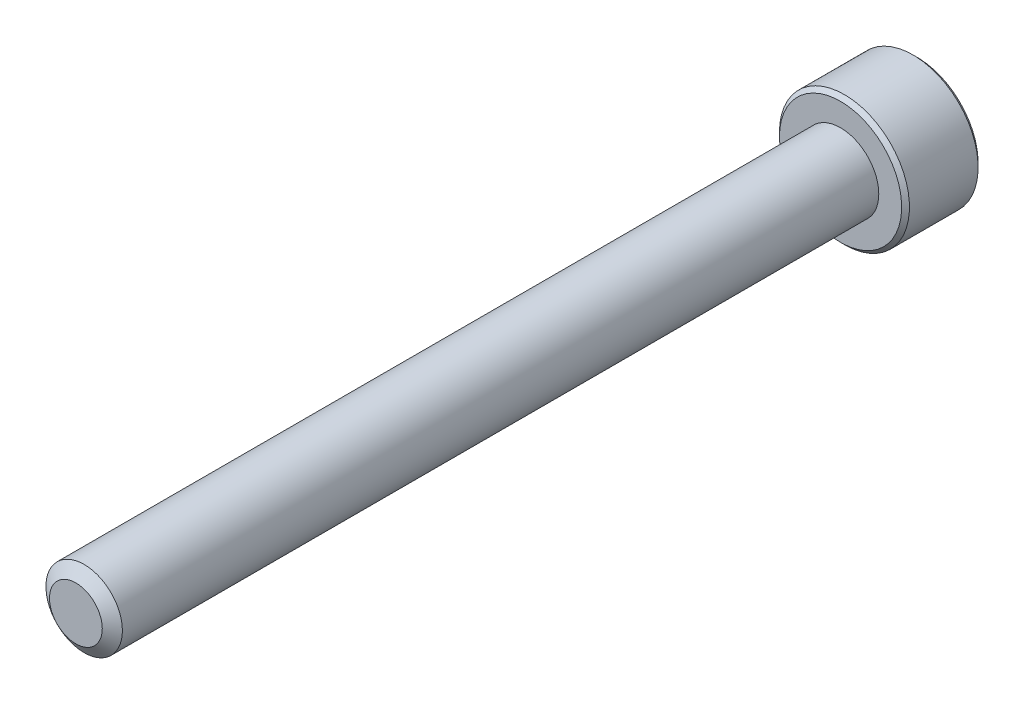
ISO-10303-21;
HEADER;
FILE_DESCRIPTION(('STEP AP214'),'2;1');
FILE_NAME('part.step','',(''),(''),'','','');
FILE_SCHEMA(('AUTOMOTIVE_DESIGN { 1 0 10303 214 1 1 1 1 }'));
ENDSEC;
DATA;
#1=APPLICATION_CONTEXT('core data for automotive mechanical design processes');
#2=APPLICATION_PROTOCOL_DEFINITION('international standard','automotive_design',2000,#1);
#3=PRODUCT_CONTEXT('',#1,'mechanical');
#4=PRODUCT('Part','Part','',(#3));
#5=PRODUCT_RELATED_PRODUCT_CATEGORY('part','',(#4));
#6=PRODUCT_DEFINITION_FORMATION('','',#4);
#7=PRODUCT_DEFINITION_CONTEXT('part definition',#1,'design');
#8=PRODUCT_DEFINITION('design','',#6,#7);
#9=PRODUCT_DEFINITION_SHAPE('','',#8);
#10=(LENGTH_UNIT() NAMED_UNIT(*) SI_UNIT(.MILLI.,.METRE.));
#11=(NAMED_UNIT(*) PLANE_ANGLE_UNIT() SI_UNIT($,.RADIAN.));
#12=(NAMED_UNIT(*) SI_UNIT($,.STERADIAN.) SOLID_ANGLE_UNIT());
#13=UNCERTAINTY_MEASURE_WITH_UNIT(LENGTH_MEASURE(1.E-05),#10,'distance_accuracy_value','');
#14=(GEOMETRIC_REPRESENTATION_CONTEXT(3) GLOBAL_UNCERTAINTY_ASSIGNED_CONTEXT((#13)) GLOBAL_UNIT_ASSIGNED_CONTEXT((#10,
#11,#12)) REPRESENTATION_CONTEXT('',''));
#15=CARTESIAN_POINT('',(0.,0.,0.));
#16=DIRECTION('',(0.,0.,1.));
#17=DIRECTION('',(1.,0.,0.));
#18=AXIS2_PLACEMENT_3D('',#15,#16,#17);
#19=CARTESIAN_POINT('',(0.,0.,-50.));
#20=DIRECTION('',(0.,0.,1.));
#21=DIRECTION('',(1.,0.,0.));
#22=AXIS2_PLACEMENT_3D('',#19,#20,#21);
#23=CYLINDRICAL_SURFACE('',#22,2.5);
#24=CARTESIAN_POINT('',(0.,0.,-0.541691224311849));
#25=DIRECTION('',(0.,0.,1.));
#26=DIRECTION('',(1.,0.,0.));
#27=AXIS2_PLACEMENT_3D('',#24,#25,#26);
#28=CIRCLE('',#27,2.5);
#29=CARTESIAN_POINT('',(2.5,0.,-0.541691224311849));
#30=VERTEX_POINT('',#29);
#31=EDGE_CURVE('E113',#30,#30,#28,.T.);
#32=ORIENTED_EDGE('',*,*,#31,.F.);
#33=EDGE_LOOP('',(#32));
#34=FACE_BOUND('',#33,.T.);
#35=CARTESIAN_POINT('',(0.,0.,-50.));
#36=DIRECTION('',(0.,0.,-1.));
#37=DIRECTION('',(-1.,0.,0.));
#38=AXIS2_PLACEMENT_3D('',#35,#36,#37);
#39=CIRCLE('',#38,2.5);
#40=CARTESIAN_POINT('',(-2.5,0.,-50.));
#41=VERTEX_POINT('',#40);
#42=EDGE_CURVE('E219',#41,#41,#39,.F.);
#43=ORIENTED_EDGE('',*,*,#42,.T.);
#44=EDGE_LOOP('',(#43));
#45=FACE_BOUND('',#44,.T.);
#46=ADVANCED_FACE('F39',(#34,#45),#23,.T.);
#47=CARTESIAN_POINT('',(0.,0.,0.));
#48=DIRECTION('',(0.,0.,-1.));
#49=DIRECTION('',(-1.,0.,0.));
#50=AXIS2_PLACEMENT_3D('',#47,#48,#49);
#51=CONICAL_SURFACE('',#50,1.72638475772933,0.959931088596884);
#52=ORIENTED_EDGE('',*,*,#31,.T.);
#53=EDGE_LOOP('',(#52));
#54=FACE_BOUND('',#53,.T.);
#55=CARTESIAN_POINT('',(0.,0.,0.));
#56=DIRECTION('',(0.,0.,1.));
#57=DIRECTION('',(1.,0.,0.));
#58=AXIS2_PLACEMENT_3D('',#55,#56,#57);
#59=CIRCLE('',#58,1.72638475772933);
#60=CARTESIAN_POINT('',(1.72638475772933,0.,0.));
#61=VERTEX_POINT('',#60);
#62=EDGE_CURVE('E217',#61,#61,#59,.T.);
#63=ORIENTED_EDGE('',*,*,#62,.F.);
#64=EDGE_LOOP('',(#63));
#65=FACE_BOUND('',#64,.T.);
#66=ADVANCED_FACE('F200',(#54,#65),#51,.T.);
#67=CARTESIAN_POINT('',(0.,0.,0.));
#68=DIRECTION('',(0.,0.,1.));
#69=DIRECTION('',(1.,0.,0.));
#70=AXIS2_PLACEMENT_3D('',#67,#68,#69);
#71=PLANE('',#70);
#72=ORIENTED_EDGE('',*,*,#62,.T.);
#73=EDGE_LOOP('',(#72));
#74=FACE_BOUND('',#73,.T.);
#75=ADVANCED_FACE('F197',(#74),#71,.T.);
#76=CARTESIAN_POINT('',(0.,0.,-55.));
#77=DIRECTION('',(0.,0.,1.));
#78=DIRECTION('',(1.,0.,0.));
#79=AXIS2_PLACEMENT_3D('',#76,#77,#78);
#80=CYLINDRICAL_SURFACE('',#79,4.25);
#81=CARTESIAN_POINT('',(0.,0.,-54.745));
#82=DIRECTION('',(0.,0.,-1.));
#83=DIRECTION('',(-1.,0.,0.));
#84=AXIS2_PLACEMENT_3D('',#81,#82,#83);
#85=CIRCLE('',#84,4.25);
#86=CARTESIAN_POINT('',(-4.25,0.,-54.745));
#87=VERTEX_POINT('',#86);
#88=EDGE_CURVE('E47',#87,#87,#85,.F.);
#89=ORIENTED_EDGE('',*,*,#88,.T.);
#90=EDGE_LOOP('',(#89));
#91=FACE_BOUND('',#90,.T.);
#92=CARTESIAN_POINT('',(0.,0.,-50.255));
#93=DIRECTION('',(0.,0.,-1.));
#94=DIRECTION('',(-1.,0.,0.));
#95=AXIS2_PLACEMENT_3D('',#92,#93,#94);
#96=CIRCLE('',#95,4.25);
#97=CARTESIAN_POINT('',(-4.25,0.,-50.255));
#98=VERTEX_POINT('',#97);
#99=EDGE_CURVE('E176',#98,#98,#96,.T.);
#100=ORIENTED_EDGE('',*,*,#99,.T.);
#101=EDGE_LOOP('',(#100));
#102=FACE_BOUND('',#101,.T.);
#103=ADVANCED_FACE('F181',(#91,#102),#80,.T.);
#104=CARTESIAN_POINT('',(0.,0.,-55.));
#105=DIRECTION('',(0.,0.,-1.));
#106=DIRECTION('',(-1.,0.,0.));
#107=AXIS2_PLACEMENT_3D('',#104,#105,#106);
#108=PLANE('',#107);
#109=CARTESIAN_POINT('',(0.,0.,-55.));
#110=DIRECTION('',(0.,0.,-1.));
#111=DIRECTION('',(-1.,0.,0.));
#112=AXIS2_PLACEMENT_3D('',#109,#110,#111);
#113=CIRCLE('',#112,3.99500000000001);
#114=CARTESIAN_POINT('',(-3.99500000000001,0.,-55.));
#115=VERTEX_POINT('',#114);
#116=EDGE_CURVE('E112',#115,#115,#113,.T.);
#117=ORIENTED_EDGE('',*,*,#116,.T.);
#118=EDGE_LOOP('',(#117));
#119=FACE_BOUND('',#118,.T.);
#120=CARTESIAN_POINT('',(0.,0.,-55.));
#121=DIRECTION('',(0.,0.,-1.));
#122=DIRECTION('',(-1.,0.,0.));
#123=AXIS2_PLACEMENT_3D('',#120,#121,#122);
#124=CIRCLE('',#123,2.3094010767585);
#125=CARTESIAN_POINT('',(-1.99999999999999,1.15470053837926,-55.));
#126=VERTEX_POINT('',#125);
#127=CARTESIAN_POINT('',(0.,2.3094010767585,-55.));
#128=VERTEX_POINT('',#127);
#129=EDGE_CURVE('E93',#126,#128,#124,.T.);
#130=ORIENTED_EDGE('',*,*,#129,.F.);
#131=CARTESIAN_POINT('',(-1.99999999999999,-1.15470053837926,-55.));
#132=VERTEX_POINT('',#131);
#133=EDGE_CURVE('E53',#132,#126,#124,.T.);
#134=ORIENTED_EDGE('',*,*,#133,.F.);
#135=CARTESIAN_POINT('',(0.,-2.3094010767585,-55.));
#136=VERTEX_POINT('',#135);
#137=EDGE_CURVE('E279',#136,#132,#124,.T.);
#138=ORIENTED_EDGE('',*,*,#137,.F.);
#139=CARTESIAN_POINT('',(1.99999999999999,-1.15470053837926,-55.));
#140=VERTEX_POINT('',#139);
#141=EDGE_CURVE('E60',#140,#136,#124,.T.);
#142=ORIENTED_EDGE('',*,*,#141,.F.);
#143=CARTESIAN_POINT('',(2.,1.15470053837926,-55.));
#144=VERTEX_POINT('',#143);
#145=EDGE_CURVE('E134',#144,#140,#124,.T.);
#146=ORIENTED_EDGE('',*,*,#145,.F.);
#147=EDGE_CURVE('E102',#128,#144,#124,.T.);
#148=ORIENTED_EDGE('',*,*,#147,.F.);
#149=EDGE_LOOP('',(#130,#134,#138,#142,#146,#148));
#150=FACE_BOUND('',#149,.T.);
#151=ADVANCED_FACE('F133',(#119,#150),#108,.T.);
#152=CARTESIAN_POINT('',(0.,0.,-50.));
#153=DIRECTION('',(0.,0.,-1.));
#154=DIRECTION('',(-1.,0.,0.));
#155=AXIS2_PLACEMENT_3D('',#152,#153,#154);
#156=PLANE('',#155);
#157=CARTESIAN_POINT('',(0.,0.,-50.));
#158=DIRECTION('',(0.,0.,-1.));
#159=DIRECTION('',(-1.,0.,0.));
#160=AXIS2_PLACEMENT_3D('',#157,#158,#159);
#161=CIRCLE('',#160,3.995);
#162=CARTESIAN_POINT('',(-3.995,0.,-50.));
#163=VERTEX_POINT('',#162);
#164=EDGE_CURVE('E11',#163,#163,#161,.F.);
#165=ORIENTED_EDGE('',*,*,#164,.T.);
#166=EDGE_LOOP('',(#165));
#167=FACE_BOUND('',#166,.T.);
#168=ORIENTED_EDGE('',*,*,#42,.F.);
#169=EDGE_LOOP('',(#168));
#170=FACE_BOUND('',#169,.T.);
#171=ADVANCED_FACE('F190',(#167,#170),#156,.F.);
#172=CARTESIAN_POINT('',(0.,0.,-55.));
#173=DIRECTION('',(0.,0.,-1.));
#174=DIRECTION('',(-1.,0.,0.));
#175=AXIS2_PLACEMENT_3D('',#172,#173,#174);
#176=CONICAL_SURFACE('',#175,2.3094010767585,0.78539816339745);
#177=ORIENTED_EDGE('',*,*,#147,.T.);
#178=CARTESIAN_POINT('',(-0.000199999999999274,2.30951654681234,-55.0001154787137));
#179=CARTESIAN_POINT('',(0.0685530340307062,2.26982196410711,-54.9604530902256));
#180=CARTESIAN_POINT('',(0.138455742135512,2.22946361676571,-54.9231199822842));
#181=CARTESIAN_POINT('',(0.280995244550437,2.1471683966763,-54.8547636851361));
#182=CARTESIAN_POINT('',(0.353645597565359,2.10522369580642,-54.8237785337372));
#183=CARTESIAN_POINT('',(0.500141601053971,2.02064418875706,-54.7707002165441));
#184=CARTESIAN_POINT('',(0.573949935246294,1.97803092714269,-54.7484736271766));
#185=CARTESIAN_POINT('',(0.723191631835264,1.89186619344273,-54.7142288166751));
#186=CARTESIAN_POINT('',(0.798620433918151,1.84831735425552,-54.7021850291441));
#187=CARTESIAN_POINT('',(0.928615500671078,1.7732646674724,-54.6913185119056));
#188=CARTESIAN_POINT('',(0.983013783970108,1.74185780396625,-54.68970975361));
#189=CARTESIAN_POINT('',(1.09172145551969,1.67909540053412,-54.6924188775987));
#190=CARTESIAN_POINT('',(1.14603080592134,1.64773988246022,-54.696738837758));
#191=CARTESIAN_POINT('',(1.25413672758934,1.5853248994842,-54.7110595674099));
#192=CARTESIAN_POINT('',(1.30793265655479,1.55426580541469,-54.721066692762));
#193=CARTESIAN_POINT('',(1.41459426230557,1.49268469862228,-54.7462124302497));
#194=CARTESIAN_POINT('',(1.46746001007071,1.46216264491917,-54.7613506490422));
#195=CARTESIAN_POINT('',(1.60287973308984,1.38397803138049,-54.8062945034292));
#196=CARTESIAN_POINT('',(1.68459383484948,1.33680037273297,-54.8394888394258));
#197=CARTESIAN_POINT('',(1.8047470372578,1.26742988897853,-54.8955258231714));
#198=CARTESIAN_POINT('',(1.84434285210918,1.24456923461531,-54.9152147029469));
#199=CARTESIAN_POINT('',(1.92280095888787,1.19927142554652,-54.9563873183649));
#200=CARTESIAN_POINT('',(1.96166368359374,1.17683402097615,-54.9778699516513));
#201=CARTESIAN_POINT('',(2.0002,1.15458506832542,-55.0001154787137));
#202=B_SPLINE_CURVE_WITH_KNOTS('',3,(#178,#179,#180,#181,#182,#183,#184,#185,#186,#187,#188,
#189,#190,#191,#192,#193,#194,#195,#196,#197,#198,#199,#200,#201),.UNSPECIFIED.,.F.,.F.,(4,2,2,
2,2,2,2,2,2,2,2,4),(0.,0.266420613771063,0.534393751523387,0.798110374376912,1.06116288956936,
1.24939906803721,1.43770123566247,1.62621426093932,1.81471283831913,2.11415604834144,
2.2634717071779,2.4126962696977),.UNSPECIFIED.);
#203=EDGE_CURVE('E107',#128,#144,#202,.T.);
#204=ORIENTED_EDGE('',*,*,#203,.F.);
#205=EDGE_LOOP('',(#177,#204));
#206=FACE_BOUND('',#205,.T.);
#207=ADVANCED_FACE('F108',(#206),#176,.F.);
#208=ORIENTED_EDGE('',*,*,#145,.T.);
#209=CARTESIAN_POINT('',(1.99999999999999,-2.30294417326429,-55.7407713552807));
#210=CARTESIAN_POINT('',(1.99999999999999,-2.24687002696278,-55.6984432738692));
#211=CARTESIAN_POINT('',(1.99999999999999,-2.19048190568582,-55.6565251570978));
#212=CARTESIAN_POINT('',(1.99999999999999,-2.07695390526152,-55.5736904180751));
#213=CARTESIAN_POINT('',(1.99999999999999,-2.01981384095229,-55.5327740498725));
#214=CARTESIAN_POINT('',(1.99999999999999,-1.90424016831613,-55.4518334522036));
#215=CARTESIAN_POINT('',(1.99999999999999,-1.84579996769762,-55.4118185917351));
#216=CARTESIAN_POINT('',(1.99999999999999,-1.72792745485625,-55.3332889938203));
#217=CARTESIAN_POINT('',(1.99999999999999,-1.66849521315186,-55.2947741503895));
#218=CARTESIAN_POINT('',(1.99999999999999,-1.48162995729573,-55.1776406517203));
#219=CARTESIAN_POINT('',(1.99999999999999,-1.35220318180736,-55.1021459018253));
#220=CARTESIAN_POINT('',(1.99999999999999,-1.08689521605219,-54.9640493510523));
#221=CARTESIAN_POINT('',(2.,-0.951037764035625,-54.901404085944));
#222=CARTESIAN_POINT('',(2.,-0.747111912337647,-54.8247635439028));
#223=CARTESIAN_POINT('',(2.,-0.682064034234153,-54.8027671799472));
#224=CARTESIAN_POINT('',(2.,-0.550398103397369,-54.7639966876876));
#225=CARTESIAN_POINT('',(2.,-0.483779942833394,-54.7472229191476));
#226=CARTESIAN_POINT('',(2.,-0.350484328974902,-54.7200482579067));
#227=CARTESIAN_POINT('',(2.,-0.283829489500057,-54.709538176761));
#228=CARTESIAN_POINT('',(2.,-0.149806987290428,-54.6950960855565));
#229=CARTESIAN_POINT('',(2.,-0.0824394490929287,-54.6911629447399));
#230=CARTESIAN_POINT('',(2.,0.0499055621213736,-54.6901664769296));
#231=CARTESIAN_POINT('',(2.,0.114881284963482,-54.6928596448403));
#232=CARTESIAN_POINT('',(2.,0.244275921290581,-54.7044300703996));
#233=CARTESIAN_POINT('',(2.,0.308694780068658,-54.7133079288031));
#234=CARTESIAN_POINT('',(2.,0.437599788400931,-54.7369136592514));
#235=CARTESIAN_POINT('',(2.,0.502067428429076,-54.7517410833941));
#236=CARTESIAN_POINT('',(2.,0.629594322371852,-54.78645788356));
#237=CARTESIAN_POINT('',(2.,0.692653693651506,-54.8063468360305));
#238=CARTESIAN_POINT('',(2.,0.891187888928461,-54.8764469791434));
#239=CARTESIAN_POINT('',(2.,1.02383545674826,-54.9346418001746));
#240=CARTESIAN_POINT('',(2.,1.28290932109377,-55.0640305752409));
#241=CARTESIAN_POINT('',(2.,1.40931112542931,-55.1352712311583));
#242=CARTESIAN_POINT('',(2.,1.59200441388854,-55.2464419915627));
#243=CARTESIAN_POINT('',(2.,1.65027548974481,-55.2831821900083));
#244=CARTESIAN_POINT('',(2.,1.76581760334353,-55.3582145138205));
#245=CARTESIAN_POINT('',(2.,1.82308856486637,-55.3965067567377));
#246=CARTESIAN_POINT('',(2.,1.93629654702498,-55.4740422636668));
#247=CARTESIAN_POINT('',(2.,1.99224062439413,-55.5132752757022));
#248=CARTESIAN_POINT('',(2.,2.10336423965704,-55.5927788302713));
#249=CARTESIAN_POINT('',(2.,2.15854398356742,-55.6330490845185));
#250=CARTESIAN_POINT('',(2.,2.21340370625405,-55.6737442376469));
#251=B_SPLINE_CURVE_WITH_KNOTS('',3,(#209,#210,#211,#212,#213,#214,#215,#216,#217,#218,#219,
#220,#221,#222,#223,#224,#225,#226,#227,#228,#229,#230,#231,#232,#233,#234,#235,#236,#237,#238,
#239,#240,#241,#242,#243,#244,#245,#246,#247,#248,#249,#250),.UNSPECIFIED.,.F.,.F.,(4,2,2,2,2,2,
2,2,2,2,2,2,2,2,2,2,2,2,2,2,4),(0.,0.210772732017007,0.421598374738835,0.634057554744616,
0.846501696032177,1.29562155480993,1.74319622856096,1.94902062142333,2.15485918958131,
2.35699582530215,2.55909770457494,2.75388435576873,2.94868993036092,3.14690093471668,
3.3450953580659,3.7783815583877,4.21325029906865,4.41989056664096,4.62654651432577,
4.83152377076246,5.03644465872343),.UNSPECIFIED.);
#252=EDGE_CURVE('E101',#144,#140,#251,.F.);
#253=ORIENTED_EDGE('',*,*,#252,.F.);
#254=EDGE_LOOP('',(#208,#253));
#255=FACE_BOUND('',#254,.T.);
#256=ADVANCED_FACE('F285',(#255),#176,.F.);
#257=ORIENTED_EDGE('',*,*,#141,.T.);
#258=CARTESIAN_POINT('',(2.00019999999999,-1.15458506832542,-55.0001154787137));
#259=CARTESIAN_POINT('',(1.93144696596929,-1.19427965103065,-54.9604530902256));
#260=CARTESIAN_POINT('',(1.86154425786448,-1.23463799837204,-54.9231199822842));
#261=CARTESIAN_POINT('',(1.71900475544956,-1.31693321846145,-54.8547636851361));
#262=CARTESIAN_POINT('',(1.64635440243464,-1.35887791933134,-54.8237785337372));
#263=CARTESIAN_POINT('',(1.49985839894602,-1.44345742638069,-54.7707002165441));
#264=CARTESIAN_POINT('',(1.4260500647537,-1.48607068799507,-54.7484736271766));
#265=CARTESIAN_POINT('',(1.27680836816473,-1.57223542169503,-54.7142288166751));
#266=CARTESIAN_POINT('',(1.20137956608185,-1.61578426088223,-54.7021850291441));
#267=CARTESIAN_POINT('',(1.07138449932892,-1.69083694766536,-54.6913185119056));
#268=CARTESIAN_POINT('',(1.01698621602989,-1.72224381117151,-54.68970975361));
#269=CARTESIAN_POINT('',(0.908278544480307,-1.78500621460364,-54.6924188775987));
#270=CARTESIAN_POINT('',(0.853969194078662,-1.81636173267754,-54.696738837758));
#271=CARTESIAN_POINT('',(0.745863272410662,-1.87877671565355,-54.7110595674099));
#272=CARTESIAN_POINT('',(0.692067343445208,-1.90983580972306,-54.721066692762));
#273=CARTESIAN_POINT('',(0.585405737694427,-1.97141691651548,-54.7462124302497));
#274=CARTESIAN_POINT('',(0.532539989929288,-2.00193897021859,-54.7613506490422));
#275=CARTESIAN_POINT('',(0.397120266910157,-2.08012358375727,-54.8062945034292));
#276=CARTESIAN_POINT('',(0.315406165150523,-2.12730124240478,-54.8394888394258));
#277=CARTESIAN_POINT('',(0.195252962742199,-2.19667172615922,-54.8955258231714));
#278=CARTESIAN_POINT('',(0.155657147890824,-2.21953238052245,-54.9152147029469));
#279=CARTESIAN_POINT('',(0.0771990411121289,-2.26483018959124,-54.9563873183649));
#280=CARTESIAN_POINT('',(0.0383363164062613,-2.28726759416161,-54.9778699516513));
#281=CARTESIAN_POINT('',(-0.000199999999997686,-2.30951654681234,-55.0001154787137));
#282=B_SPLINE_CURVE_WITH_KNOTS('',3,(#258,#259,#260,#261,#262,#263,#264,#265,#266,#267,#268,
#269,#270,#271,#272,#273,#274,#275,#276,#277,#278,#279,#280,#281),.UNSPECIFIED.,.F.,.F.,(4,2,2,
2,2,2,2,2,2,2,2,4),(0.,0.266420613771063,0.534393751523386,0.79811037437691,1.06116288956936,
1.24939906803721,1.43770123566247,1.62621426093931,1.81471283831913,2.11415604834144,
2.2634717071779,2.4126962696977),.UNSPECIFIED.);
#283=EDGE_CURVE('E144',#140,#136,#282,.T.);
#284=ORIENTED_EDGE('',*,*,#283,.F.);
#285=EDGE_LOOP('',(#257,#284));
#286=FACE_BOUND('',#285,.T.);
#287=ADVANCED_FACE('F282',(#286),#176,.F.);
#288=ORIENTED_EDGE('',*,*,#137,.T.);
#289=CARTESIAN_POINT('',(0.000199999999999847,-2.30951654681234,-55.0001154787137));
#290=CARTESIAN_POINT('',(-0.0685530340307067,-2.26982196410711,-54.9604530902256));
#291=CARTESIAN_POINT('',(-0.138455742135514,-2.22946361676572,-54.9231199822842));
#292=CARTESIAN_POINT('',(-0.28099524455044,-2.1471683966763,-54.8547636851361));
#293=CARTESIAN_POINT('',(-0.353645597565362,-2.10522369580642,-54.8237785337372));
#294=CARTESIAN_POINT('',(-0.500141601053975,-2.02064418875706,-54.7707002165441));
#295=CARTESIAN_POINT('',(-0.573949935246299,-1.97803092714269,-54.7484736271766));
#296=CARTESIAN_POINT('',(-0.72319163183527,-1.89186619344273,-54.7142288166751));
#297=CARTESIAN_POINT('',(-0.798620433918157,-1.84831735425552,-54.7021850291441));
#298=CARTESIAN_POINT('',(-0.928615500671085,-1.77326466747239,-54.6913185119056));
#299=CARTESIAN_POINT('',(-0.983013783970115,-1.74185780396625,-54.68970975361));
#300=CARTESIAN_POINT('',(-1.0917214555197,-1.67909540053412,-54.6924188775987));
#301=CARTESIAN_POINT('',(-1.14603080592135,-1.64773988246021,-54.696738837758));
#302=CARTESIAN_POINT('',(-1.25413672758934,-1.5853248994842,-54.7110595674099));
#303=CARTESIAN_POINT('',(-1.3079326565548,-1.55426580541469,-54.721066692762));
#304=CARTESIAN_POINT('',(-1.41459426230558,-1.49268469862228,-54.7462124302497));
#305=CARTESIAN_POINT('',(-1.46746001007072,-1.46216264491916,-54.7613506490422));
#306=CARTESIAN_POINT('',(-1.60287973308985,-1.38397803138049,-54.8062945034292));
#307=CARTESIAN_POINT('',(-1.68459383484948,-1.33680037273297,-54.8394888394258));
#308=CARTESIAN_POINT('',(-1.8047470372578,-1.26742988897853,-54.8955258231714));
#309=CARTESIAN_POINT('',(-1.84434285210918,-1.24456923461531,-54.9152147029469));
#310=CARTESIAN_POINT('',(-1.92280095888787,-1.19927142554652,-54.9563873183649));
#311=CARTESIAN_POINT('',(-1.96166368359374,-1.17683402097615,-54.9778699516513));
#312=CARTESIAN_POINT('',(-2.0002,-1.15458506832542,-55.0001154787137));
#313=B_SPLINE_CURVE_WITH_KNOTS('',3,(#289,#290,#291,#292,#293,#294,#295,#296,#297,#298,#299,
#300,#301,#302,#303,#304,#305,#306,#307,#308,#309,#310,#311,#312),.UNSPECIFIED.,.F.,.F.,(4,2,2,
2,2,2,2,2,2,2,2,4),(0.,0.266420613771066,0.534393751523391,0.798110374376919,1.06116288956937,
1.24939906803722,1.43770123566248,1.62621426093932,1.81471283831914,2.11415604834145,
2.2634717071779,2.4126962696977),.UNSPECIFIED.);
#314=EDGE_CURVE('E256',#136,#132,#313,.T.);
#315=ORIENTED_EDGE('',*,*,#314,.F.);
#316=EDGE_LOOP('',(#288,#315));
#317=FACE_BOUND('',#316,.T.);
#318=ADVANCED_FACE('F281',(#317),#176,.F.);
#319=ORIENTED_EDGE('',*,*,#133,.T.);
#320=CARTESIAN_POINT('',(-1.99999999999999,-2.30294417292923,-55.7407713550277));
#321=CARTESIAN_POINT('',(-1.99999999999999,-2.24687002663712,-55.698443273626));
#322=CARTESIAN_POINT('',(-1.99999999999999,-2.19048190536959,-55.6565251568643));
#323=CARTESIAN_POINT('',(-1.99999999999999,-2.07695390496425,-55.573690417861));
#324=CARTESIAN_POINT('',(-1.99999999999999,-2.01981384066454,-55.5327740496681));
#325=CARTESIAN_POINT('',(-1.99999999999999,-1.90424016804776,-55.4518334520186));
#326=CARTESIAN_POINT('',(-1.99999999999999,-1.8457999674391,-55.4118185915599));
#327=CARTESIAN_POINT('',(-1.99999999999999,-1.72792745461761,-55.3332889936643));
#328=CARTESIAN_POINT('',(-1.99999999999999,-1.66849521292324,-55.2947741502431));
#329=CARTESIAN_POINT('',(-1.99999999999999,-1.4816299571002,-55.1776406516043));
#330=CARTESIAN_POINT('',(-1.99999999999999,-1.35220318163537,-55.1021459017296));
#331=CARTESIAN_POINT('',(-1.99999999999999,-1.08689521592925,-54.9640493509944));
#332=CARTESIAN_POINT('',(-1.99999999999999,-0.951037763938194,-54.9014040859035));
#333=CARTESIAN_POINT('',(-1.99999999999999,-0.74711191225941,-54.8247635438751));
#334=CARTESIAN_POINT('',(-1.99999999999999,-0.682064034147877,-54.8027671799191));
#335=CARTESIAN_POINT('',(-1.99999999999999,-0.550398103294753,-54.7639966876601));
#336=CARTESIAN_POINT('',(-1.99999999999999,-0.483779942722477,-54.7472229191212));
#337=CARTESIAN_POINT('',(-1.99999999999999,-0.350484328847656,-54.7200482578844));
#338=CARTESIAN_POINT('',(-1.99999999999999,-0.283829489364787,-54.7095381767417));
#339=CARTESIAN_POINT('',(-1.99999999999999,-0.149806987139378,-54.6950960855449));
#340=CARTESIAN_POINT('',(-1.99999999999999,-0.0824394489341233,-54.6911629447331));
#341=CARTESIAN_POINT('',(-1.99999999999999,0.0499055622944882,-54.6901664769337));
#342=CARTESIAN_POINT('',(-1.99999999999999,0.11488128514317,-54.6928596448504));
#343=CARTESIAN_POINT('',(-1.99999999999999,0.244275921482759,-54.7044300704227));
#344=CARTESIAN_POINT('',(-1.99999999999999,0.308694780266751,-54.7133079288332));
#345=CARTESIAN_POINT('',(-1.99999999999999,0.437599788610703,-54.7369136592961));
#346=CARTESIAN_POINT('',(-1.99999999999999,0.502067428644592,-54.7517410834465));
#347=CARTESIAN_POINT('',(-1.99999999999999,0.629594322598304,-54.786457883628));
#348=CARTESIAN_POINT('',(-1.99999999999999,0.692653693883148,-54.8063468361063));
#349=CARTESIAN_POINT('',(-1.99999999999999,0.891187889210541,-54.8764469792562));
#350=CARTESIAN_POINT('',(-1.99999999999999,1.02383545707306,-54.9346418003215));
#351=CARTESIAN_POINT('',(-1.99999999999999,1.28290932150074,-55.0640305754596));
#352=CARTESIAN_POINT('',(-1.99999999999999,1.4093111258757,-55.1352712314148));
#353=CARTESIAN_POINT('',(-1.99999999999999,1.59200441438962,-55.2464419918747));
#354=CARTESIAN_POINT('',(-1.99999999999999,1.6502754902619,-55.2831821903374));
#355=CARTESIAN_POINT('',(-1.99999999999999,1.76581760389242,-55.3582145141838));
#356=CARTESIAN_POINT('',(-1.99999999999999,1.82308856543104,-55.396506757118));
#357=CARTESIAN_POINT('',(-1.99999999999999,1.93629654762083,-55.4740422640812));
#358=CARTESIAN_POINT('',(-1.99999999999999,1.99224062500538,-55.5132752761336));
#359=CARTESIAN_POINT('',(-1.99999999999999,2.10336424029899,-55.5927788307365));
#360=CARTESIAN_POINT('',(-1.99999999999999,2.15854398422467,-55.6330490850006));
#361=CARTESIAN_POINT('',(-1.99999999999999,2.21340370692658,-55.6737442381459));
#362=B_SPLINE_CURVE_WITH_KNOTS('',3,(#320,#321,#322,#323,#324,#325,#326,#327,#328,#329,#330,
#331,#332,#333,#334,#335,#336,#337,#338,#339,#340,#341,#342,#343,#344,#345,#346,#347,#348,#349,
#350,#351,#352,#353,#354,#355,#356,#357,#358,#359,#360,#361),.UNSPECIFIED.,.F.,.F.,(4,2,2,2,2,2,
2,2,2,2,2,2,2,2,2,2,2,2,2,2,4),(0.,0.210772731976889,0.421598374658587,0.634057554623482,
0.846501695870167,1.29562155455624,1.74319622821645,1.94902062110208,2.15485918928326,
2.35699582502635,2.5590977043214,2.75388435553556,2.94868993014815,3.14690093452586,
3.34509535789702,3.77838155837654,4.21325029921625,4.41989056685646,4.62654651460921,
4.8315237711129,5.03644465914085),.UNSPECIFIED.);
#363=EDGE_CURVE('E123',#132,#126,#362,.T.);
#364=ORIENTED_EDGE('',*,*,#363,.F.);
#365=EDGE_LOOP('',(#319,#364));
#366=FACE_BOUND('',#365,.T.);
#367=ADVANCED_FACE('F294',(#366),#176,.F.);
#368=ORIENTED_EDGE('',*,*,#129,.T.);
#369=CARTESIAN_POINT('',(-2.00019999999999,1.15458506832542,-55.0001154787137));
#370=CARTESIAN_POINT('',(-1.93144696596929,1.19427965103065,-54.9604530902256));
#371=CARTESIAN_POINT('',(-1.86154425786448,1.23463799837204,-54.9231199822842));
#372=CARTESIAN_POINT('',(-1.71900475544956,1.31693321846145,-54.8547636851361));
#373=CARTESIAN_POINT('',(-1.64635440243464,1.35887791933134,-54.8237785337372));
#374=CARTESIAN_POINT('',(-1.49985839894602,1.44345742638069,-54.7707002165441));
#375=CARTESIAN_POINT('',(-1.4260500647537,1.48607068799507,-54.7484736271766));
#376=CARTESIAN_POINT('',(-1.27680836816473,1.57223542169503,-54.7142288166751));
#377=CARTESIAN_POINT('',(-1.20137956608184,1.61578426088223,-54.7021850291441));
#378=CARTESIAN_POINT('',(-1.07138449932892,1.69083694766536,-54.6913185119056));
#379=CARTESIAN_POINT('',(-1.01698621602989,1.72224381117151,-54.68970975361));
#380=CARTESIAN_POINT('',(-0.908278544480303,1.78500621460364,-54.6924188775987));
#381=CARTESIAN_POINT('',(-0.853969194078657,1.81636173267754,-54.696738837758));
#382=CARTESIAN_POINT('',(-0.745863272410659,1.87877671565355,-54.7110595674099));
#383=CARTESIAN_POINT('',(-0.692067343445205,1.90983580972306,-54.721066692762));
#384=CARTESIAN_POINT('',(-0.585405737694424,1.97141691651547,-54.7462124302497));
#385=CARTESIAN_POINT('',(-0.532539989929284,2.00193897021859,-54.7613506490422));
#386=CARTESIAN_POINT('',(-0.397120266910153,2.08012358375727,-54.8062945034292));
#387=CARTESIAN_POINT('',(-0.315406165150518,2.12730124240478,-54.8394888394258));
#388=CARTESIAN_POINT('',(-0.195252962742196,2.19667172615922,-54.8955258231714));
#389=CARTESIAN_POINT('',(-0.155657147890822,2.21953238052245,-54.9152147029469));
#390=CARTESIAN_POINT('',(-0.0771990411121268,2.26483018959123,-54.9563873183649));
#391=CARTESIAN_POINT('',(-0.0383363164062586,2.28726759416161,-54.9778699516513));
#392=CARTESIAN_POINT('',(0.000200000000002134,2.30951654681234,-55.0001154787137));
#393=B_SPLINE_CURVE_WITH_KNOTS('',3,(#369,#370,#371,#372,#373,#374,#375,#376,#377,#378,#379,
#380,#381,#382,#383,#384,#385,#386,#387,#388,#389,#390,#391,#392),.UNSPECIFIED.,.F.,.F.,(4,2,2,
2,2,2,2,2,2,2,2,4),(0.,0.266420613771063,0.534393751523385,0.798110374376911,1.06116288956936,
1.24939906803721,1.43770123566247,1.62621426093931,1.81471283831913,2.11415604834144,
2.2634717071779,2.4126962696977),.UNSPECIFIED.);
#394=EDGE_CURVE('E97',#126,#128,#393,.T.);
#395=ORIENTED_EDGE('',*,*,#394,.F.);
#396=EDGE_LOOP('',(#368,#395));
#397=FACE_BOUND('',#396,.T.);
#398=ADVANCED_FACE('F95',(#397),#176,.F.);
#399=CARTESIAN_POINT('',(-1.99999999999999,1.15470053837925,-52.));
#400=DIRECTION('',(0.,0.,1.));
#401=DIRECTION('',(1.,0.,0.));
#402=AXIS2_PLACEMENT_3D('',#399,#400,#401);
#403=PLANE('',#402);
#404=DIRECTION('',(0.866025403784439,0.5,0.));
#405=VECTOR('',#404,1.);
#406=CARTESIAN_POINT('',(-1.99999999999999,1.15470053837925,-52.));
#407=LINE('',#406,#405);
#408=CARTESIAN_POINT('',(-1.99999999999999,1.15470053837925,-52.));
#409=VERTEX_POINT('',#408);
#410=CARTESIAN_POINT('',(0.,2.3094010767585,-52.));
#411=VERTEX_POINT('',#410);
#412=EDGE_CURVE('E122',#409,#411,#407,.T.);
#413=ORIENTED_EDGE('',*,*,#412,.T.);
#414=DIRECTION('',(0.866025403784439,-0.499999999999999,0.));
#415=VECTOR('',#414,1.);
#416=CARTESIAN_POINT('',(0.,2.3094010767585,-52.));
#417=LINE('',#416,#415);
#418=CARTESIAN_POINT('',(2.,1.15470053837926,-52.));
#419=VERTEX_POINT('',#418);
#420=EDGE_CURVE('E127',#411,#419,#417,.T.);
#421=ORIENTED_EDGE('',*,*,#420,.T.);
#422=DIRECTION('',(0.,-1.,0.));
#423=VECTOR('',#422,1.);
#424=CARTESIAN_POINT('',(2.,1.15470053837926,-52.));
#425=LINE('',#424,#423);
#426=CARTESIAN_POINT('',(1.99999999999999,-1.15470053837925,-52.));
#427=VERTEX_POINT('',#426);
#428=EDGE_CURVE('E242',#419,#427,#425,.T.);
#429=ORIENTED_EDGE('',*,*,#428,.T.);
#430=DIRECTION('',(-0.866025403784438,-0.500000000000001,0.));
#431=VECTOR('',#430,1.);
#432=CARTESIAN_POINT('',(1.99999999999999,-1.15470053837925,-52.));
#433=LINE('',#432,#431);
#434=CARTESIAN_POINT('',(0.,-2.3094010767585,-52.));
#435=VERTEX_POINT('',#434);
#436=EDGE_CURVE('E239',#427,#435,#433,.T.);
#437=ORIENTED_EDGE('',*,*,#436,.T.);
#438=DIRECTION('',(-0.866025403784439,0.5,0.));
#439=VECTOR('',#438,1.);
#440=CARTESIAN_POINT('',(0.,-2.3094010767585,-52.));
#441=LINE('',#440,#439);
#442=CARTESIAN_POINT('',(-1.99999999999999,-1.15470053837926,-52.));
#443=VERTEX_POINT('',#442);
#444=EDGE_CURVE('E236',#435,#443,#441,.T.);
#445=ORIENTED_EDGE('',*,*,#444,.T.);
#446=DIRECTION('',(0.,1.,0.));
#447=VECTOR('',#446,1.);
#448=CARTESIAN_POINT('',(-1.99999999999999,-1.15470053837926,-52.));
#449=LINE('',#448,#447);
#450=EDGE_CURVE('E130',#443,#409,#449,.T.);
#451=ORIENTED_EDGE('',*,*,#450,.T.);
#452=EDGE_LOOP('',(#413,#421,#429,#437,#445,#451));
#453=FACE_BOUND('',#452,.T.);
#454=ADVANCED_FACE('F164',(#453),#403,.F.);
#455=CARTESIAN_POINT('',(0.,2.3094010767585,-52.));
#456=DIRECTION('',(0.499999999999999,0.866025403784439,0.));
#457=DIRECTION('',(-0.866025403784439,0.499999999999999,0.));
#458=AXIS2_PLACEMENT_3D('',#455,#456,#457);
#459=PLANE('',#458);
#460=DIRECTION('',(0.,0.,-1.));
#461=VECTOR('',#460,1.);
#462=CARTESIAN_POINT('',(0.,2.3094010767585,-52.));
#463=LINE('',#462,#461);
#464=EDGE_CURVE('E119',#411,#128,#463,.T.);
#465=ORIENTED_EDGE('',*,*,#464,.T.);
#466=ORIENTED_EDGE('',*,*,#203,.T.);
#467=DIRECTION('',(0.,0.,-1.));
#468=VECTOR('',#467,1.);
#469=CARTESIAN_POINT('',(2.,1.15470053837926,-52.));
#470=LINE('',#469,#468);
#471=EDGE_CURVE('E129',#419,#144,#470,.T.);
#472=ORIENTED_EDGE('',*,*,#471,.F.);
#473=ORIENTED_EDGE('',*,*,#420,.F.);
#474=EDGE_LOOP('',(#465,#466,#472,#473));
#475=FACE_BOUND('',#474,.T.);
#476=ADVANCED_FACE('F125',(#475),#459,.F.);
#477=CARTESIAN_POINT('',(2.,1.15470053837926,-52.));
#478=DIRECTION('',(1.,0.,0.));
#479=DIRECTION('',(0.,1.,0.));
#480=AXIS2_PLACEMENT_3D('',#477,#478,#479);
#481=PLANE('',#480);
#482=ORIENTED_EDGE('',*,*,#471,.T.);
#483=ORIENTED_EDGE('',*,*,#252,.T.);
#484=DIRECTION('',(0.,0.,-1.));
#485=VECTOR('',#484,1.);
#486=CARTESIAN_POINT('',(1.99999999999999,-1.15470053837925,-52.));
#487=LINE('',#486,#485);
#488=EDGE_CURVE('E225',#427,#140,#487,.T.);
#489=ORIENTED_EDGE('',*,*,#488,.F.);
#490=ORIENTED_EDGE('',*,*,#428,.F.);
#491=EDGE_LOOP('',(#482,#483,#489,#490));
#492=FACE_BOUND('',#491,.T.);
#493=ADVANCED_FACE('F153',(#492),#481,.F.);
#494=CARTESIAN_POINT('',(1.99999999999999,-1.15470053837925,-52.));
#495=DIRECTION('',(0.500000000000001,-0.866025403784438,0.));
#496=DIRECTION('',(0.866025403784438,0.500000000000001,0.));
#497=AXIS2_PLACEMENT_3D('',#494,#495,#496);
#498=PLANE('',#497);
#499=ORIENTED_EDGE('',*,*,#488,.T.);
#500=ORIENTED_EDGE('',*,*,#283,.T.);
#501=DIRECTION('',(0.,0.,-1.));
#502=VECTOR('',#501,1.);
#503=CARTESIAN_POINT('',(0.,-2.3094010767585,-52.));
#504=LINE('',#503,#502);
#505=EDGE_CURVE('E228',#435,#136,#504,.T.);
#506=ORIENTED_EDGE('',*,*,#505,.F.);
#507=ORIENTED_EDGE('',*,*,#436,.F.);
#508=EDGE_LOOP('',(#499,#500,#506,#507));
#509=FACE_BOUND('',#508,.T.);
#510=ADVANCED_FACE('F157',(#509),#498,.F.);
#511=CARTESIAN_POINT('',(0.,-2.3094010767585,-52.));
#512=DIRECTION('',(-0.5,-0.866025403784439,0.));
#513=DIRECTION('',(0.866025403784439,-0.5,0.));
#514=AXIS2_PLACEMENT_3D('',#511,#512,#513);
#515=PLANE('',#514);
#516=ORIENTED_EDGE('',*,*,#505,.T.);
#517=ORIENTED_EDGE('',*,*,#314,.T.);
#518=DIRECTION('',(0.,0.,-1.));
#519=VECTOR('',#518,1.);
#520=CARTESIAN_POINT('',(-1.99999999999999,-1.15470053837926,-52.));
#521=LINE('',#520,#519);
#522=EDGE_CURVE('E231',#443,#132,#521,.T.);
#523=ORIENTED_EDGE('',*,*,#522,.F.);
#524=ORIENTED_EDGE('',*,*,#444,.F.);
#525=EDGE_LOOP('',(#516,#517,#523,#524));
#526=FACE_BOUND('',#525,.T.);
#527=ADVANCED_FACE('F264',(#526),#515,.F.);
#528=CARTESIAN_POINT('',(-1.99999999999999,-1.15470053837926,-52.));
#529=DIRECTION('',(-1.,0.,0.));
#530=DIRECTION('',(0.,0.,1.));
#531=AXIS2_PLACEMENT_3D('',#528,#529,#530);
#532=PLANE('',#531);
#533=ORIENTED_EDGE('',*,*,#522,.T.);
#534=ORIENTED_EDGE('',*,*,#363,.T.);
#535=DIRECTION('',(0.,0.,-1.));
#536=VECTOR('',#535,1.);
#537=CARTESIAN_POINT('',(-1.99999999999999,1.15470053837925,-52.));
#538=LINE('',#537,#536);
#539=EDGE_CURVE('E121',#409,#126,#538,.T.);
#540=ORIENTED_EDGE('',*,*,#539,.F.);
#541=ORIENTED_EDGE('',*,*,#450,.F.);
#542=EDGE_LOOP('',(#533,#534,#540,#541));
#543=FACE_BOUND('',#542,.T.);
#544=ADVANCED_FACE('F261',(#543),#532,.F.);
#545=CARTESIAN_POINT('',(-1.99999999999999,1.15470053837925,-52.));
#546=DIRECTION('',(-0.5,0.866025403784439,0.));
#547=DIRECTION('',(-0.866025403784439,-0.5,0.));
#548=AXIS2_PLACEMENT_3D('',#545,#546,#547);
#549=PLANE('',#548);
#550=ORIENTED_EDGE('',*,*,#539,.T.);
#551=ORIENTED_EDGE('',*,*,#394,.T.);
#552=ORIENTED_EDGE('',*,*,#464,.F.);
#553=ORIENTED_EDGE('',*,*,#412,.F.);
#554=EDGE_LOOP('',(#550,#551,#552,#553));
#555=FACE_BOUND('',#554,.T.);
#556=ADVANCED_FACE('F117',(#555),#549,.F.);
#557=CARTESIAN_POINT('',(0.,0.,-55.));
#558=DIRECTION('',(0.,0.,1.));
#559=DIRECTION('',(1.,0.,0.));
#560=AXIS2_PLACEMENT_3D('',#557,#558,#559);
#561=CONICAL_SURFACE('',#560,3.99500000000001,0.785398163397442);
#562=ORIENTED_EDGE('',*,*,#88,.F.);
#563=EDGE_LOOP('',(#562));
#564=FACE_BOUND('',#563,.T.);
#565=ORIENTED_EDGE('',*,*,#116,.F.);
#566=EDGE_LOOP('',(#565));
#567=FACE_BOUND('',#566,.T.);
#568=ADVANCED_FACE('F184',(#564,#567),#561,.T.);
#569=CARTESIAN_POINT('',(0.,0.,-50.255));
#570=DIRECTION('',(0.,0.,-1.));
#571=DIRECTION('',(-1.,0.,0.));
#572=AXIS2_PLACEMENT_3D('',#569,#570,#571);
#573=CONICAL_SURFACE('',#572,4.25,0.785398163397442);
#574=ORIENTED_EDGE('',*,*,#164,.F.);
#575=EDGE_LOOP('',(#574));
#576=FACE_BOUND('',#575,.T.);
#577=ORIENTED_EDGE('',*,*,#99,.F.);
#578=EDGE_LOOP('',(#577));
#579=FACE_BOUND('',#578,.T.);
#580=ADVANCED_FACE('F41',(#576,#579),#573,.T.);
#581=CLOSED_SHELL('',(#46,#66,#75,#103,#151,#171,#207,#256,#287,#318,#367,#398,#454,#476,#493,
#510,#527,#544,#556,#568,#580));
#582=MANIFOLD_SOLID_BREP('B2',#581);
#583=ADVANCED_BREP_SHAPE_REPRESENTATION('',(#18,#582),#14);
#584=SHAPE_DEFINITION_REPRESENTATION(#9,#583);
ENDSEC;
END-ISO-10303-21;
